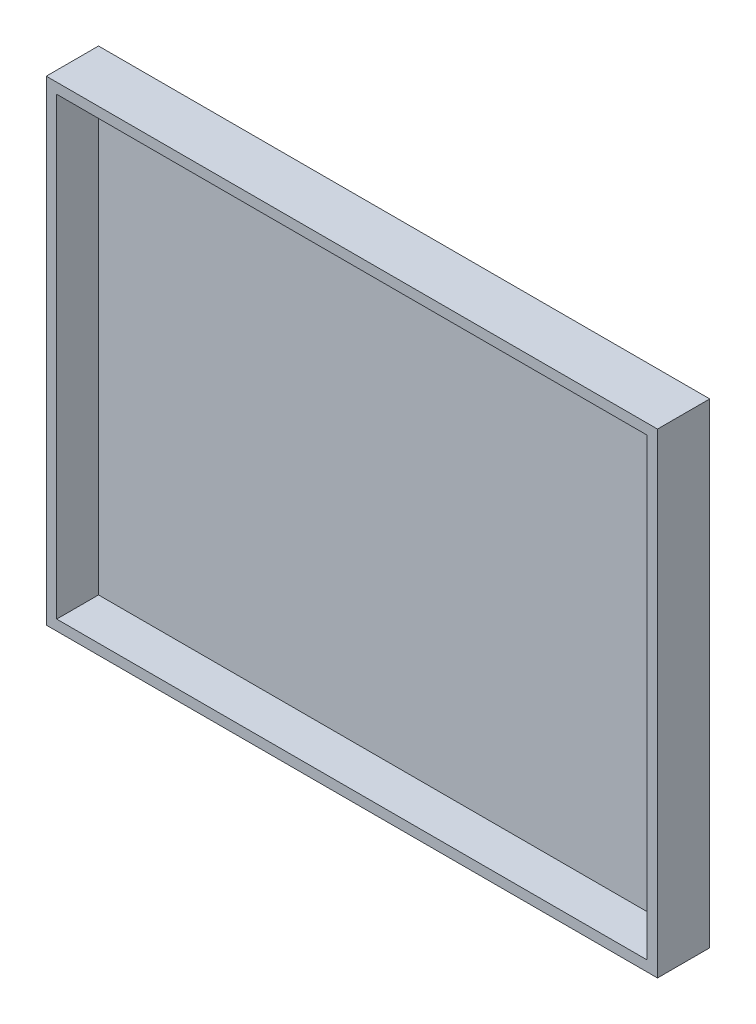
ISO-10303-21;
HEADER;
FILE_DESCRIPTION(('STEP AP214'),'2;1');
FILE_NAME('part.step','',(''),(''),'','','');
FILE_SCHEMA(('AUTOMOTIVE_DESIGN { 1 0 10303 214 1 1 1 1 }'));
ENDSEC;
DATA;
#1=APPLICATION_CONTEXT('core data for automotive mechanical design processes');
#2=APPLICATION_PROTOCOL_DEFINITION('international standard','automotive_design',2000,#1);
#3=PRODUCT_CONTEXT('',#1,'mechanical');
#4=PRODUCT('Part','Part','',(#3));
#5=PRODUCT_RELATED_PRODUCT_CATEGORY('part','',(#4));
#6=PRODUCT_DEFINITION_FORMATION('','',#4);
#7=PRODUCT_DEFINITION_CONTEXT('part definition',#1,'design');
#8=PRODUCT_DEFINITION('design','',#6,#7);
#9=PRODUCT_DEFINITION_SHAPE('','',#8);
#10=(LENGTH_UNIT() NAMED_UNIT(*) SI_UNIT(.MILLI.,.METRE.));
#11=(NAMED_UNIT(*) PLANE_ANGLE_UNIT() SI_UNIT($,.RADIAN.));
#12=(NAMED_UNIT(*) SI_UNIT($,.STERADIAN.) SOLID_ANGLE_UNIT());
#13=UNCERTAINTY_MEASURE_WITH_UNIT(LENGTH_MEASURE(1.E-05),#10,'distance_accuracy_value','');
#14=(GEOMETRIC_REPRESENTATION_CONTEXT(3) GLOBAL_UNCERTAINTY_ASSIGNED_CONTEXT((#13)) GLOBAL_UNIT_ASSIGNED_CONTEXT((#10,
#11,#12)) REPRESENTATION_CONTEXT('',''));
#15=CARTESIAN_POINT('',(0.,0.,0.));
#16=DIRECTION('',(0.,0.,1.));
#17=DIRECTION('',(1.,0.,0.));
#18=AXIS2_PLACEMENT_3D('',#15,#16,#17);
#19=CARTESIAN_POINT('',(0.,0.,10.));
#20=DIRECTION('',(1.,0.,0.));
#21=DIRECTION('',(0.,0.,-1.));
#22=AXIS2_PLACEMENT_3D('',#19,#20,#21);
#23=PLANE('',#22);
#24=DIRECTION('',(0.,-1.,0.));
#25=VECTOR('',#24,1.);
#26=CARTESIAN_POINT('',(0.,0.,0.));
#27=LINE('',#26,#25);
#28=CARTESIAN_POINT('',(0.,91.,0.));
#29=VERTEX_POINT('',#28);
#30=CARTESIAN_POINT('',(0.,0.,0.));
#31=VERTEX_POINT('',#30);
#32=EDGE_CURVE('E164',#29,#31,#27,.T.);
#33=ORIENTED_EDGE('',*,*,#32,.T.);
#34=DIRECTION('',(0.,0.,-1.));
#35=VECTOR('',#34,1.);
#36=CARTESIAN_POINT('',(0.,0.,10.));
#37=LINE('',#36,#35);
#38=CARTESIAN_POINT('',(0.,0.,10.));
#39=VERTEX_POINT('',#38);
#40=EDGE_CURVE('E11',#39,#31,#37,.T.);
#41=ORIENTED_EDGE('',*,*,#40,.F.);
#42=DIRECTION('',(0.,-1.,0.));
#43=VECTOR('',#42,1.);
#44=CARTESIAN_POINT('',(0.,0.,10.));
#45=LINE('',#44,#43);
#46=CARTESIAN_POINT('',(0.,91.,10.));
#47=VERTEX_POINT('',#46);
#48=EDGE_CURVE('E170',#47,#39,#45,.T.);
#49=ORIENTED_EDGE('',*,*,#48,.F.);
#50=DIRECTION('',(0.,0.,-1.));
#51=VECTOR('',#50,1.);
#52=CARTESIAN_POINT('',(0.,91.,10.));
#53=LINE('',#52,#51);
#54=EDGE_CURVE('E180',#47,#29,#53,.T.);
#55=ORIENTED_EDGE('',*,*,#54,.T.);
#56=EDGE_LOOP('',(#33,#41,#49,#55));
#57=FACE_BOUND('',#56,.T.);
#58=ADVANCED_FACE('F45',(#57),#23,.F.);
#59=CARTESIAN_POINT('',(0.,0.,10.));
#60=DIRECTION('',(0.,1.,0.));
#61=DIRECTION('',(0.,0.,1.));
#62=AXIS2_PLACEMENT_3D('',#59,#60,#61);
#63=PLANE('',#62);
#64=DIRECTION('',(1.,0.,0.));
#65=VECTOR('',#64,1.);
#66=CARTESIAN_POINT('',(0.,0.,0.));
#67=LINE('',#66,#65);
#68=CARTESIAN_POINT('',(117.,0.,0.));
#69=VERTEX_POINT('',#68);
#70=EDGE_CURVE('E184',#31,#69,#67,.T.);
#71=ORIENTED_EDGE('',*,*,#70,.T.);
#72=DIRECTION('',(0.,0.,-1.));
#73=VECTOR('',#72,1.);
#74=CARTESIAN_POINT('',(117.,0.,10.));
#75=LINE('',#74,#73);
#76=CARTESIAN_POINT('',(117.,0.,10.));
#77=VERTEX_POINT('',#76);
#78=EDGE_CURVE('E53',#77,#69,#75,.T.);
#79=ORIENTED_EDGE('',*,*,#78,.F.);
#80=DIRECTION('',(1.,0.,0.));
#81=VECTOR('',#80,1.);
#82=CARTESIAN_POINT('',(0.,0.,10.));
#83=LINE('',#82,#81);
#84=EDGE_CURVE('E97',#39,#77,#83,.T.);
#85=ORIENTED_EDGE('',*,*,#84,.F.);
#86=ORIENTED_EDGE('',*,*,#40,.T.);
#87=EDGE_LOOP('',(#71,#79,#85,#86));
#88=FACE_BOUND('',#87,.T.);
#89=ADVANCED_FACE('F220',(#88),#63,.F.);
#90=CARTESIAN_POINT('',(117.,0.,10.));
#91=DIRECTION('',(-1.,0.,0.));
#92=DIRECTION('',(0.,0.,1.));
#93=AXIS2_PLACEMENT_3D('',#90,#91,#92);
#94=PLANE('',#93);
#95=DIRECTION('',(0.,1.,0.));
#96=VECTOR('',#95,1.);
#97=CARTESIAN_POINT('',(117.,0.,0.));
#98=LINE('',#97,#96);
#99=CARTESIAN_POINT('',(117.,91.,0.));
#100=VERTEX_POINT('',#99);
#101=EDGE_CURVE('E187',#69,#100,#98,.T.);
#102=ORIENTED_EDGE('',*,*,#101,.T.);
#103=DIRECTION('',(0.,0.,-1.));
#104=VECTOR('',#103,1.);
#105=CARTESIAN_POINT('',(117.,91.,10.));
#106=LINE('',#105,#104);
#107=CARTESIAN_POINT('',(117.,91.,10.));
#108=VERTEX_POINT('',#107);
#109=EDGE_CURVE('E194',#108,#100,#106,.T.);
#110=ORIENTED_EDGE('',*,*,#109,.F.);
#111=DIRECTION('',(0.,1.,0.));
#112=VECTOR('',#111,1.);
#113=CARTESIAN_POINT('',(117.,0.,10.));
#114=LINE('',#113,#112);
#115=EDGE_CURVE('E175',#77,#108,#114,.T.);
#116=ORIENTED_EDGE('',*,*,#115,.F.);
#117=ORIENTED_EDGE('',*,*,#78,.T.);
#118=EDGE_LOOP('',(#102,#110,#116,#117));
#119=FACE_BOUND('',#118,.T.);
#120=ADVANCED_FACE('F201',(#119),#94,.F.);
#121=CARTESIAN_POINT('',(0.,91.,10.));
#122=DIRECTION('',(0.,-1.,0.));
#123=DIRECTION('',(0.,0.,-1.));
#124=AXIS2_PLACEMENT_3D('',#121,#122,#123);
#125=PLANE('',#124);
#126=DIRECTION('',(-1.,0.,0.));
#127=VECTOR('',#126,1.);
#128=CARTESIAN_POINT('',(0.,91.,0.));
#129=LINE('',#128,#127);
#130=EDGE_CURVE('E90',#100,#29,#129,.T.);
#131=ORIENTED_EDGE('',*,*,#130,.T.);
#132=ORIENTED_EDGE('',*,*,#54,.F.);
#133=DIRECTION('',(-1.,0.,0.));
#134=VECTOR('',#133,1.);
#135=CARTESIAN_POINT('',(0.,91.,10.));
#136=LINE('',#135,#134);
#137=EDGE_CURVE('E69',#108,#47,#136,.T.);
#138=ORIENTED_EDGE('',*,*,#137,.F.);
#139=ORIENTED_EDGE('',*,*,#109,.T.);
#140=EDGE_LOOP('',(#131,#132,#138,#139));
#141=FACE_BOUND('',#140,.T.);
#142=ADVANCED_FACE('F209',(#141),#125,.F.);
#143=CARTESIAN_POINT('',(0.,0.,10.));
#144=DIRECTION('',(0.,0.,-1.));
#145=DIRECTION('',(-1.,0.,0.));
#146=AXIS2_PLACEMENT_3D('',#143,#144,#145);
#147=PLANE('',#146);
#148=DIRECTION('',(1.,0.,0.));
#149=VECTOR('',#148,1.);
#150=CARTESIAN_POINT('',(2.00000000000001,2.,10.));
#151=LINE('',#150,#149);
#152=CARTESIAN_POINT('',(2.00000000000001,2.,10.));
#153=VERTEX_POINT('',#152);
#154=CARTESIAN_POINT('',(115.,2.,10.));
#155=VERTEX_POINT('',#154);
#156=EDGE_CURVE('E155',#153,#155,#151,.T.);
#157=ORIENTED_EDGE('',*,*,#156,.F.);
#158=DIRECTION('',(0.,-1.,0.));
#159=VECTOR('',#158,1.);
#160=CARTESIAN_POINT('',(2.,89.,10.));
#161=LINE('',#160,#159);
#162=CARTESIAN_POINT('',(2.,89.,10.));
#163=VERTEX_POINT('',#162);
#164=EDGE_CURVE('E60',#163,#153,#161,.T.);
#165=ORIENTED_EDGE('',*,*,#164,.F.);
#166=DIRECTION('',(-1.,0.,0.));
#167=VECTOR('',#166,1.);
#168=CARTESIAN_POINT('',(2.,89.,10.));
#169=LINE('',#168,#167);
#170=CARTESIAN_POINT('',(115.,89.,10.));
#171=VERTEX_POINT('',#170);
#172=EDGE_CURVE('E142',#171,#163,#169,.T.);
#173=ORIENTED_EDGE('',*,*,#172,.F.);
#174=DIRECTION('',(0.,1.,0.));
#175=VECTOR('',#174,1.);
#176=CARTESIAN_POINT('',(115.,89.,10.));
#177=LINE('',#176,#175);
#178=EDGE_CURVE('E146',#155,#171,#177,.T.);
#179=ORIENTED_EDGE('',*,*,#178,.F.);
#180=EDGE_LOOP('',(#157,#165,#173,#179));
#181=FACE_BOUND('',#180,.T.);
#182=ORIENTED_EDGE('',*,*,#48,.T.);
#183=ORIENTED_EDGE('',*,*,#84,.T.);
#184=ORIENTED_EDGE('',*,*,#115,.T.);
#185=ORIENTED_EDGE('',*,*,#137,.T.);
#186=EDGE_LOOP('',(#182,#183,#184,#185));
#187=FACE_BOUND('',#186,.T.);
#188=ADVANCED_FACE('F211',(#181,#187),#147,.F.);
#189=CARTESIAN_POINT('',(0.,0.,0.));
#190=DIRECTION('',(0.,0.,-1.));
#191=DIRECTION('',(-1.,0.,0.));
#192=AXIS2_PLACEMENT_3D('',#189,#190,#191);
#193=PLANE('',#192);
#194=ORIENTED_EDGE('',*,*,#32,.F.);
#195=ORIENTED_EDGE('',*,*,#130,.F.);
#196=ORIENTED_EDGE('',*,*,#101,.F.);
#197=ORIENTED_EDGE('',*,*,#70,.F.);
#198=EDGE_LOOP('',(#194,#195,#196,#197));
#199=FACE_BOUND('',#198,.T.);
#200=ADVANCED_FACE('F205',(#199),#193,.T.);
#201=CARTESIAN_POINT('',(2.,89.,2.));
#202=DIRECTION('',(-1.,0.,0.));
#203=DIRECTION('',(0.,-1.,0.));
#204=AXIS2_PLACEMENT_3D('',#201,#202,#203);
#205=PLANE('',#204);
#206=ORIENTED_EDGE('',*,*,#164,.T.);
#207=DIRECTION('',(0.,0.,1.));
#208=VECTOR('',#207,1.);
#209=CARTESIAN_POINT('',(2.00000000000001,2.,2.));
#210=LINE('',#209,#208);
#211=CARTESIAN_POINT('',(2.00000000000001,2.,2.));
#212=VERTEX_POINT('',#211);
#213=EDGE_CURVE('E117',#212,#153,#210,.T.);
#214=ORIENTED_EDGE('',*,*,#213,.F.);
#215=DIRECTION('',(0.,-1.,0.));
#216=VECTOR('',#215,1.);
#217=CARTESIAN_POINT('',(2.,89.,2.));
#218=LINE('',#217,#216);
#219=CARTESIAN_POINT('',(2.,89.,2.));
#220=VERTEX_POINT('',#219);
#221=EDGE_CURVE('E121',#220,#212,#218,.T.);
#222=ORIENTED_EDGE('',*,*,#221,.F.);
#223=DIRECTION('',(0.,0.,1.));
#224=VECTOR('',#223,1.);
#225=CARTESIAN_POINT('',(2.,89.,2.));
#226=LINE('',#225,#224);
#227=EDGE_CURVE('E161',#220,#163,#226,.T.);
#228=ORIENTED_EDGE('',*,*,#227,.T.);
#229=EDGE_LOOP('',(#206,#214,#222,#228));
#230=FACE_BOUND('',#229,.T.);
#231=ADVANCED_FACE('F119',(#230),#205,.F.);
#232=CARTESIAN_POINT('',(2.,89.,2.));
#233=DIRECTION('',(0.,1.,0.));
#234=DIRECTION('',(0.,0.,1.));
#235=AXIS2_PLACEMENT_3D('',#232,#233,#234);
#236=PLANE('',#235);
#237=ORIENTED_EDGE('',*,*,#172,.T.);
#238=ORIENTED_EDGE('',*,*,#227,.F.);
#239=DIRECTION('',(-1.,0.,0.));
#240=VECTOR('',#239,1.);
#241=CARTESIAN_POINT('',(2.,89.,2.));
#242=LINE('',#241,#240);
#243=CARTESIAN_POINT('',(115.,89.,2.));
#244=VERTEX_POINT('',#243);
#245=EDGE_CURVE('E128',#244,#220,#242,.T.);
#246=ORIENTED_EDGE('',*,*,#245,.F.);
#247=DIRECTION('',(0.,0.,1.));
#248=VECTOR('',#247,1.);
#249=CARTESIAN_POINT('',(115.,89.,2.));
#250=LINE('',#249,#248);
#251=EDGE_CURVE('E165',#244,#171,#250,.T.);
#252=ORIENTED_EDGE('',*,*,#251,.T.);
#253=EDGE_LOOP('',(#237,#238,#246,#252));
#254=FACE_BOUND('',#253,.T.);
#255=ADVANCED_FACE('F260',(#254),#236,.F.);
#256=CARTESIAN_POINT('',(115.,89.,2.));
#257=DIRECTION('',(1.,0.,0.));
#258=DIRECTION('',(0.,1.,0.));
#259=AXIS2_PLACEMENT_3D('',#256,#257,#258);
#260=PLANE('',#259);
#261=ORIENTED_EDGE('',*,*,#178,.T.);
#262=ORIENTED_EDGE('',*,*,#251,.F.);
#263=DIRECTION('',(0.,1.,0.));
#264=VECTOR('',#263,1.);
#265=CARTESIAN_POINT('',(115.,89.,2.));
#266=LINE('',#265,#264);
#267=CARTESIAN_POINT('',(115.,2.,2.));
#268=VERTEX_POINT('',#267);
#269=EDGE_CURVE('E137',#268,#244,#266,.T.);
#270=ORIENTED_EDGE('',*,*,#269,.F.);
#271=DIRECTION('',(0.,0.,1.));
#272=VECTOR('',#271,1.);
#273=CARTESIAN_POINT('',(115.,2.,2.));
#274=LINE('',#273,#272);
#275=EDGE_CURVE('E127',#268,#155,#274,.T.);
#276=ORIENTED_EDGE('',*,*,#275,.T.);
#277=EDGE_LOOP('',(#261,#262,#270,#276));
#278=FACE_BOUND('',#277,.T.);
#279=ADVANCED_FACE('F269',(#278),#260,.F.);
#280=CARTESIAN_POINT('',(2.00000000000001,2.,2.));
#281=DIRECTION('',(0.,-1.,0.));
#282=DIRECTION('',(0.,0.,-1.));
#283=AXIS2_PLACEMENT_3D('',#280,#281,#282);
#284=PLANE('',#283);
#285=ORIENTED_EDGE('',*,*,#156,.T.);
#286=ORIENTED_EDGE('',*,*,#275,.F.);
#287=DIRECTION('',(1.,0.,0.));
#288=VECTOR('',#287,1.);
#289=CARTESIAN_POINT('',(2.00000000000001,2.,2.));
#290=LINE('',#289,#288);
#291=EDGE_CURVE('E131',#212,#268,#290,.T.);
#292=ORIENTED_EDGE('',*,*,#291,.F.);
#293=ORIENTED_EDGE('',*,*,#213,.T.);
#294=EDGE_LOOP('',(#285,#286,#292,#293));
#295=FACE_BOUND('',#294,.T.);
#296=ADVANCED_FACE('F132',(#295),#284,.F.);
#297=CARTESIAN_POINT('',(0.,0.,2.));
#298=DIRECTION('',(0.,0.,1.));
#299=DIRECTION('',(1.,0.,0.));
#300=AXIS2_PLACEMENT_3D('',#297,#298,#299);
#301=PLANE('',#300);
#302=ORIENTED_EDGE('',*,*,#221,.T.);
#303=ORIENTED_EDGE('',*,*,#291,.T.);
#304=ORIENTED_EDGE('',*,*,#269,.T.);
#305=ORIENTED_EDGE('',*,*,#245,.T.);
#306=EDGE_LOOP('',(#302,#303,#304,#305));
#307=FACE_BOUND('',#306,.T.);
#308=ADVANCED_FACE('F139',(#307),#301,.T.);
#309=CLOSED_SHELL('',(#58,#89,#120,#142,#188,#200,#231,#255,#279,#296,#308));
#310=MANIFOLD_SOLID_BREP('B2',#309);
#311=ADVANCED_BREP_SHAPE_REPRESENTATION('',(#18,#310),#14);
#312=SHAPE_DEFINITION_REPRESENTATION(#9,#311);
ENDSEC;
END-ISO-10303-21;
